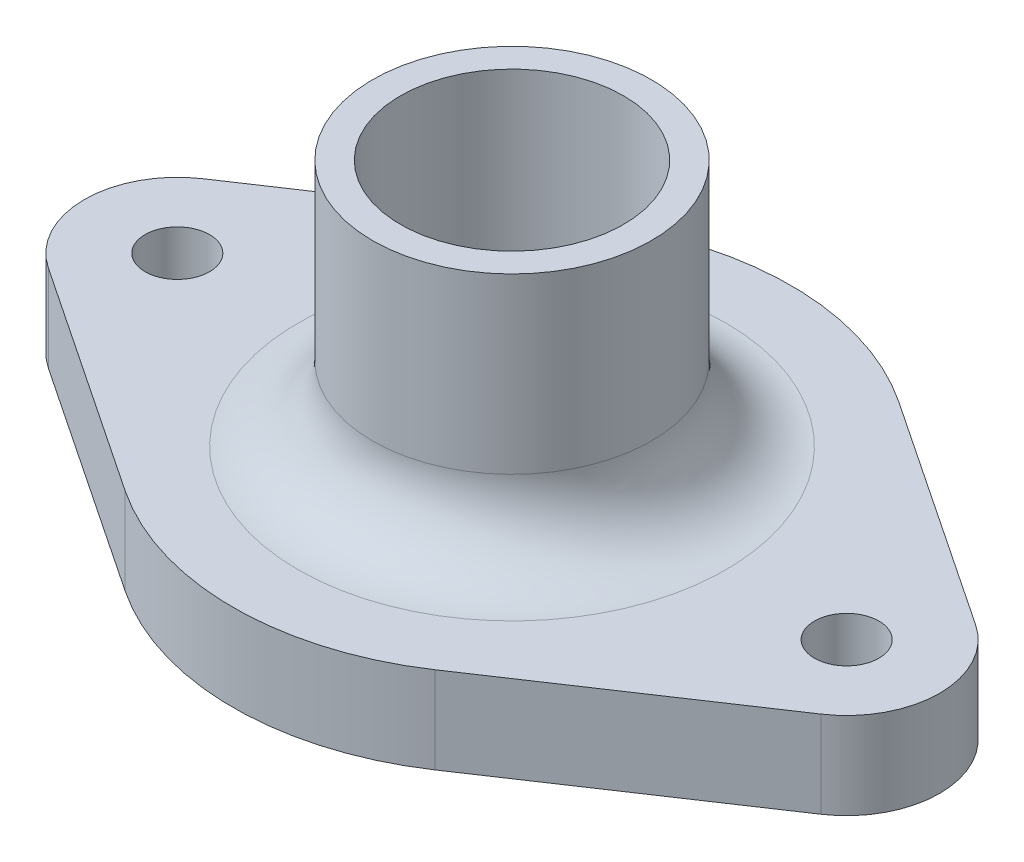
ISO-10303-21;
HEADER;
FILE_DESCRIPTION(('STEP AP214'),'2;1');
FILE_NAME('part.step','',(''),(''),'','','');
FILE_SCHEMA(('AUTOMOTIVE_DESIGN { 1 0 10303 214 1 1 1 1 }'));
ENDSEC;
DATA;
#1=APPLICATION_CONTEXT('core data for automotive mechanical design processes');
#2=APPLICATION_PROTOCOL_DEFINITION('international standard','automotive_design',2000,#1);
#3=PRODUCT_CONTEXT('',#1,'mechanical');
#4=PRODUCT('Part','Part','',(#3));
#5=PRODUCT_RELATED_PRODUCT_CATEGORY('part','',(#4));
#6=PRODUCT_DEFINITION_FORMATION('','',#4);
#7=PRODUCT_DEFINITION_CONTEXT('part definition',#1,'design');
#8=PRODUCT_DEFINITION('design','',#6,#7);
#9=PRODUCT_DEFINITION_SHAPE('','',#8);
#10=(LENGTH_UNIT() NAMED_UNIT(*) SI_UNIT(.MILLI.,.METRE.));
#11=(NAMED_UNIT(*) PLANE_ANGLE_UNIT() SI_UNIT($,.RADIAN.));
#12=(NAMED_UNIT(*) SI_UNIT($,.STERADIAN.) SOLID_ANGLE_UNIT());
#13=UNCERTAINTY_MEASURE_WITH_UNIT(LENGTH_MEASURE(1.E-05),#10,'distance_accuracy_value','');
#14=(GEOMETRIC_REPRESENTATION_CONTEXT(3) GLOBAL_UNCERTAINTY_ASSIGNED_CONTEXT((#13)) GLOBAL_UNIT_ASSIGNED_CONTEXT((#10,
#11,#12)) REPRESENTATION_CONTEXT('',''));
#15=CARTESIAN_POINT('',(0.,0.,0.));
#16=DIRECTION('',(0.,0.,1.));
#17=DIRECTION('',(1.,0.,0.));
#18=AXIS2_PLACEMENT_3D('',#15,#16,#17);
#19=CARTESIAN_POINT('',(0.,7.,0.));
#20=DIRECTION('',(0.,1.,0.));
#21=DIRECTION('',(0.,0.,1.));
#22=AXIS2_PLACEMENT_3D('',#19,#20,#21);
#23=PLANE('',#22);
#24=CARTESIAN_POINT('',(0.,7.,0.));
#25=DIRECTION('',(0.,1.,0.));
#26=DIRECTION('',(0.,0.,1.));
#27=AXIS2_PLACEMENT_3D('',#24,#25,#26);
#28=CIRCLE('',#27,17.25);
#29=CARTESIAN_POINT('',(0.,7.,17.25));
#30=VERTEX_POINT('',#29);
#31=EDGE_CURVE('E11',#30,#30,#28,.F.);
#32=ORIENTED_EDGE('',*,*,#31,.T.);
#33=EDGE_LOOP('',(#32));
#34=FACE_BOUND('',#33,.T.);
#35=CARTESIAN_POINT('',(-27.,7.,0.));
#36=DIRECTION('',(0.,1.,0.));
#37=DIRECTION('',(0.,0.,1.));
#38=AXIS2_PLACEMENT_3D('',#35,#36,#37);
#39=CIRCLE('',#38,2.6);
#40=CARTESIAN_POINT('',(-27.,7.,2.60000000000001));
#41=VERTEX_POINT('',#40);
#42=EDGE_CURVE('E139',#41,#41,#39,.T.);
#43=ORIENTED_EDGE('',*,*,#42,.F.);
#44=EDGE_LOOP('',(#43));
#45=FACE_BOUND('',#44,.T.);
#46=CARTESIAN_POINT('',(0.,7.,0.));
#47=DIRECTION('',(0.,1.,0.));
#48=DIRECTION('',(0.,0.,1.));
#49=AXIS2_PLACEMENT_3D('',#46,#47,#48);
#50=CIRCLE('',#49,22.5);
#51=CARTESIAN_POINT('',(-12.5,7.,18.7082869338697));
#52=VERTEX_POINT('',#51);
#53=CARTESIAN_POINT('',(12.5,7.,18.7082869338697));
#54=VERTEX_POINT('',#53);
#55=EDGE_CURVE('E150',#52,#54,#50,.T.);
#56=ORIENTED_EDGE('',*,*,#55,.T.);
#57=DIRECTION('',(0.831479419283098,0.,-0.555555555555556));
#58=VECTOR('',#57,1.);
#59=CARTESIAN_POINT('',(12.5,7.,18.7082869338697));
#60=LINE('',#59,#58);
#61=CARTESIAN_POINT('',(31.1666666666667,7.,6.23609564462323));
#62=VERTEX_POINT('',#61);
#63=EDGE_CURVE('E98',#54,#62,#60,.T.);
#64=ORIENTED_EDGE('',*,*,#63,.T.);
#65=CARTESIAN_POINT('',(27.,7.,0.));
#66=DIRECTION('',(0.,1.,0.));
#67=DIRECTION('',(0.,0.,1.));
#68=AXIS2_PLACEMENT_3D('',#65,#66,#67);
#69=CIRCLE('',#68,7.5);
#70=CARTESIAN_POINT('',(31.1666666666667,7.,-6.23609564462324));
#71=VERTEX_POINT('',#70);
#72=EDGE_CURVE('E234',#62,#71,#69,.T.);
#73=ORIENTED_EDGE('',*,*,#72,.T.);
#74=DIRECTION('',(-0.831479419283098,0.,-0.555555555555555));
#75=VECTOR('',#74,1.);
#76=CARTESIAN_POINT('',(12.5,7.,-18.7082869338697));
#77=LINE('',#76,#75);
#78=CARTESIAN_POINT('',(12.5,7.,-18.7082869338697));
#79=VERTEX_POINT('',#78);
#80=EDGE_CURVE('E236',#71,#79,#77,.T.);
#81=ORIENTED_EDGE('',*,*,#80,.T.);
#82=CARTESIAN_POINT('',(0.,7.,0.));
#83=DIRECTION('',(0.,1.,0.));
#84=DIRECTION('',(0.,0.,1.));
#85=AXIS2_PLACEMENT_3D('',#82,#83,#84);
#86=CIRCLE('',#85,22.5);
#87=CARTESIAN_POINT('',(-12.5,7.,-18.7082869338697));
#88=VERTEX_POINT('',#87);
#89=EDGE_CURVE('E117',#79,#88,#86,.T.);
#90=ORIENTED_EDGE('',*,*,#89,.T.);
#91=DIRECTION('',(-0.831479419283098,0.,0.555555555555556));
#92=VECTOR('',#91,1.);
#93=CARTESIAN_POINT('',(-31.1666666666667,7.,-6.23609564462322));
#94=LINE('',#93,#92);
#95=CARTESIAN_POINT('',(-31.1666666666667,7.,-6.23609564462322));
#96=VERTEX_POINT('',#95);
#97=EDGE_CURVE('E111',#88,#96,#94,.T.);
#98=ORIENTED_EDGE('',*,*,#97,.T.);
#99=CARTESIAN_POINT('',(-27.,7.,0.));
#100=DIRECTION('',(0.,1.,0.));
#101=DIRECTION('',(0.,0.,1.));
#102=AXIS2_PLACEMENT_3D('',#99,#100,#101);
#103=CIRCLE('',#102,7.5);
#104=CARTESIAN_POINT('',(-31.1666666666667,7.,6.23609564462324));
#105=VERTEX_POINT('',#104);
#106=EDGE_CURVE('E115',#96,#105,#103,.T.);
#107=ORIENTED_EDGE('',*,*,#106,.T.);
#108=DIRECTION('',(0.831479419283098,0.,0.555555555555555));
#109=VECTOR('',#108,1.);
#110=CARTESIAN_POINT('',(-31.1666666666667,7.,6.23609564462324));
#111=LINE('',#110,#109);
#112=EDGE_CURVE('E54',#105,#52,#111,.T.);
#113=ORIENTED_EDGE('',*,*,#112,.T.);
#114=EDGE_LOOP('',(#56,#64,#73,#81,#90,#98,#107,#113));
#115=FACE_BOUND('',#114,.T.);
#116=CARTESIAN_POINT('',(27.,7.,0.));
#117=DIRECTION('',(0.,1.,0.));
#118=DIRECTION('',(0.,0.,1.));
#119=AXIS2_PLACEMENT_3D('',#116,#117,#118);
#120=CIRCLE('',#119,2.6);
#121=CARTESIAN_POINT('',(27.,7.,2.59999999999999));
#122=VERTEX_POINT('',#121);
#123=EDGE_CURVE('E245',#122,#122,#120,.T.);
#124=ORIENTED_EDGE('',*,*,#123,.F.);
#125=EDGE_LOOP('',(#124));
#126=FACE_BOUND('',#125,.T.);
#127=ADVANCED_FACE('F37',(#34,#45,#115,#126),#23,.T.);
#128=CARTESIAN_POINT('',(0.,0.,0.));
#129=DIRECTION('',(0.,1.,0.));
#130=DIRECTION('',(0.,0.,1.));
#131=AXIS2_PLACEMENT_3D('',#128,#129,#130);
#132=PLANE('',#131);
#133=CARTESIAN_POINT('',(0.,0.,0.));
#134=DIRECTION('',(0.,1.,0.));
#135=DIRECTION('',(0.,0.,1.));
#136=AXIS2_PLACEMENT_3D('',#133,#134,#135);
#137=CIRCLE('',#136,22.5);
#138=CARTESIAN_POINT('',(-12.5,0.,18.7082869338697));
#139=VERTEX_POINT('',#138);
#140=CARTESIAN_POINT('',(12.5,0.,18.7082869338697));
#141=VERTEX_POINT('',#140);
#142=EDGE_CURVE('E135',#139,#141,#137,.T.);
#143=ORIENTED_EDGE('',*,*,#142,.F.);
#144=DIRECTION('',(0.831479419283098,0.,0.555555555555555));
#145=VECTOR('',#144,1.);
#146=CARTESIAN_POINT('',(-31.1666666666667,0.,6.23609564462324));
#147=LINE('',#146,#145);
#148=CARTESIAN_POINT('',(-31.1666666666667,0.,6.23609564462324));
#149=VERTEX_POINT('',#148);
#150=EDGE_CURVE('E89',#149,#139,#147,.T.);
#151=ORIENTED_EDGE('',*,*,#150,.F.);
#152=CARTESIAN_POINT('',(-27.,0.,0.));
#153=DIRECTION('',(0.,1.,0.));
#154=DIRECTION('',(0.,0.,1.));
#155=AXIS2_PLACEMENT_3D('',#152,#153,#154);
#156=CIRCLE('',#155,7.5);
#157=CARTESIAN_POINT('',(-31.1666666666667,0.,-6.23609564462322));
#158=VERTEX_POINT('',#157);
#159=EDGE_CURVE('E83',#158,#149,#156,.T.);
#160=ORIENTED_EDGE('',*,*,#159,.F.);
#161=DIRECTION('',(-0.831479419283098,0.,0.555555555555556));
#162=VECTOR('',#161,1.);
#163=CARTESIAN_POINT('',(-31.1666666666667,0.,-6.23609564462322));
#164=LINE('',#163,#162);
#165=CARTESIAN_POINT('',(-12.5,0.,-18.7082869338697));
#166=VERTEX_POINT('',#165);
#167=EDGE_CURVE('E125',#166,#158,#164,.T.);
#168=ORIENTED_EDGE('',*,*,#167,.F.);
#169=CARTESIAN_POINT('',(0.,0.,0.));
#170=DIRECTION('',(0.,1.,0.));
#171=DIRECTION('',(0.,0.,1.));
#172=AXIS2_PLACEMENT_3D('',#169,#170,#171);
#173=CIRCLE('',#172,22.5);
#174=CARTESIAN_POINT('',(12.5,0.,-18.7082869338697));
#175=VERTEX_POINT('',#174);
#176=EDGE_CURVE('E145',#175,#166,#173,.T.);
#177=ORIENTED_EDGE('',*,*,#176,.F.);
#178=DIRECTION('',(-0.831479419283098,0.,-0.555555555555555));
#179=VECTOR('',#178,1.);
#180=CARTESIAN_POINT('',(12.5,0.,-18.7082869338697));
#181=LINE('',#180,#179);
#182=CARTESIAN_POINT('',(31.1666666666667,0.,-6.23609564462324));
#183=VERTEX_POINT('',#182);
#184=EDGE_CURVE('E143',#183,#175,#181,.T.);
#185=ORIENTED_EDGE('',*,*,#184,.F.);
#186=CARTESIAN_POINT('',(27.,0.,0.));
#187=DIRECTION('',(0.,1.,0.));
#188=DIRECTION('',(0.,0.,1.));
#189=AXIS2_PLACEMENT_3D('',#186,#187,#188);
#190=CIRCLE('',#189,7.5);
#191=CARTESIAN_POINT('',(31.1666666666667,0.,6.23609564462323));
#192=VERTEX_POINT('',#191);
#193=EDGE_CURVE('E141',#192,#183,#190,.T.);
#194=ORIENTED_EDGE('',*,*,#193,.F.);
#195=DIRECTION('',(0.831479419283098,0.,-0.555555555555556));
#196=VECTOR('',#195,1.);
#197=CARTESIAN_POINT('',(12.5,0.,18.7082869338697));
#198=LINE('',#197,#196);
#199=EDGE_CURVE('E138',#141,#192,#198,.T.);
#200=ORIENTED_EDGE('',*,*,#199,.F.);
#201=EDGE_LOOP('',(#143,#151,#160,#168,#177,#185,#194,#200));
#202=FACE_BOUND('',#201,.T.);
#203=CARTESIAN_POINT('',(-27.,0.,0.));
#204=DIRECTION('',(0.,1.,0.));
#205=DIRECTION('',(0.,0.,1.));
#206=AXIS2_PLACEMENT_3D('',#203,#204,#205);
#207=CIRCLE('',#206,2.6);
#208=CARTESIAN_POINT('',(-27.,0.,2.60000000000001));
#209=VERTEX_POINT('',#208);
#210=EDGE_CURVE('E242',#209,#209,#207,.T.);
#211=ORIENTED_EDGE('',*,*,#210,.T.);
#212=EDGE_LOOP('',(#211));
#213=FACE_BOUND('',#212,.T.);
#214=CARTESIAN_POINT('',(27.,0.,0.));
#215=DIRECTION('',(0.,1.,0.));
#216=DIRECTION('',(0.,0.,1.));
#217=AXIS2_PLACEMENT_3D('',#214,#215,#216);
#218=CIRCLE('',#217,2.6);
#219=CARTESIAN_POINT('',(27.,0.,2.59999999999999));
#220=VERTEX_POINT('',#219);
#221=EDGE_CURVE('E248',#220,#220,#218,.T.);
#222=ORIENTED_EDGE('',*,*,#221,.T.);
#223=EDGE_LOOP('',(#222));
#224=FACE_BOUND('',#223,.T.);
#225=ADVANCED_FACE('F187',(#202,#213,#224),#132,.F.);
#226=CARTESIAN_POINT('',(0.,7.,0.));
#227=DIRECTION('',(0.,-1.,0.));
#228=DIRECTION('',(0.,0.,-1.));
#229=AXIS2_PLACEMENT_3D('',#226,#227,#228);
#230=CYLINDRICAL_SURFACE('',#229,22.5);
#231=ORIENTED_EDGE('',*,*,#142,.T.);
#232=DIRECTION('',(0.,-1.,0.));
#233=VECTOR('',#232,1.);
#234=CARTESIAN_POINT('',(12.5,7.,18.7082869338697));
#235=LINE('',#234,#233);
#236=EDGE_CURVE('E163',#54,#141,#235,.T.);
#237=ORIENTED_EDGE('',*,*,#236,.F.);
#238=ORIENTED_EDGE('',*,*,#55,.F.);
#239=DIRECTION('',(0.,-1.,0.));
#240=VECTOR('',#239,1.);
#241=CARTESIAN_POINT('',(-12.5,7.,18.7082869338697));
#242=LINE('',#241,#240);
#243=EDGE_CURVE('E131',#52,#139,#242,.T.);
#244=ORIENTED_EDGE('',*,*,#243,.T.);
#245=EDGE_LOOP('',(#231,#237,#238,#244));
#246=FACE_BOUND('',#245,.T.);
#247=ADVANCED_FACE('F193',(#246),#230,.T.);
#248=CARTESIAN_POINT('',(12.5,7.,18.7082869338697));
#249=DIRECTION('',(-0.555555555555556,0.,-0.831479419283098));
#250=DIRECTION('',(-0.831479419283098,0.,0.555555555555556));
#251=AXIS2_PLACEMENT_3D('',#248,#249,#250);
#252=PLANE('',#251);
#253=ORIENTED_EDGE('',*,*,#199,.T.);
#254=DIRECTION('',(0.,-1.,0.));
#255=VECTOR('',#254,1.);
#256=CARTESIAN_POINT('',(31.1666666666667,7.,6.23609564462323));
#257=LINE('',#256,#255);
#258=EDGE_CURVE('E160',#62,#192,#257,.T.);
#259=ORIENTED_EDGE('',*,*,#258,.F.);
#260=ORIENTED_EDGE('',*,*,#63,.F.);
#261=ORIENTED_EDGE('',*,*,#236,.T.);
#262=EDGE_LOOP('',(#253,#259,#260,#261));
#263=FACE_BOUND('',#262,.T.);
#264=ADVANCED_FACE('F219',(#263),#252,.F.);
#265=CARTESIAN_POINT('',(27.,7.,0.));
#266=DIRECTION('',(0.,-1.,0.));
#267=DIRECTION('',(0.,0.,-1.));
#268=AXIS2_PLACEMENT_3D('',#265,#266,#267);
#269=CYLINDRICAL_SURFACE('',#268,7.5);
#270=ORIENTED_EDGE('',*,*,#193,.T.);
#271=DIRECTION('',(0.,-1.,0.));
#272=VECTOR('',#271,1.);
#273=CARTESIAN_POINT('',(31.1666666666667,7.,-6.23609564462324));
#274=LINE('',#273,#272);
#275=EDGE_CURVE('E157',#71,#183,#274,.T.);
#276=ORIENTED_EDGE('',*,*,#275,.F.);
#277=ORIENTED_EDGE('',*,*,#72,.F.);
#278=ORIENTED_EDGE('',*,*,#258,.T.);
#279=EDGE_LOOP('',(#270,#276,#277,#278));
#280=FACE_BOUND('',#279,.T.);
#281=ADVANCED_FACE('F215',(#280),#269,.T.);
#282=CARTESIAN_POINT('',(12.5,7.,-18.7082869338697));
#283=DIRECTION('',(-0.555555555555555,0.,0.831479419283098));
#284=DIRECTION('',(0.831479419283098,0.,0.555555555555555));
#285=AXIS2_PLACEMENT_3D('',#282,#283,#284);
#286=PLANE('',#285);
#287=ORIENTED_EDGE('',*,*,#184,.T.);
#288=DIRECTION('',(0.,-1.,0.));
#289=VECTOR('',#288,1.);
#290=CARTESIAN_POINT('',(12.5,7.,-18.7082869338697));
#291=LINE('',#290,#289);
#292=EDGE_CURVE('E154',#79,#175,#291,.T.);
#293=ORIENTED_EDGE('',*,*,#292,.F.);
#294=ORIENTED_EDGE('',*,*,#80,.F.);
#295=ORIENTED_EDGE('',*,*,#275,.T.);
#296=EDGE_LOOP('',(#287,#293,#294,#295));
#297=FACE_BOUND('',#296,.T.);
#298=ADVANCED_FACE('F211',(#297),#286,.F.);
#299=CARTESIAN_POINT('',(0.,7.,0.));
#300=DIRECTION('',(0.,-1.,0.));
#301=DIRECTION('',(0.,0.,-1.));
#302=AXIS2_PLACEMENT_3D('',#299,#300,#301);
#303=CYLINDRICAL_SURFACE('',#302,22.5);
#304=ORIENTED_EDGE('',*,*,#176,.T.);
#305=DIRECTION('',(0.,-1.,0.));
#306=VECTOR('',#305,1.);
#307=CARTESIAN_POINT('',(-12.5,7.,-18.7082869338697));
#308=LINE('',#307,#306);
#309=EDGE_CURVE('E126',#88,#166,#308,.T.);
#310=ORIENTED_EDGE('',*,*,#309,.F.);
#311=ORIENTED_EDGE('',*,*,#89,.F.);
#312=ORIENTED_EDGE('',*,*,#292,.T.);
#313=EDGE_LOOP('',(#304,#310,#311,#312));
#314=FACE_BOUND('',#313,.T.);
#315=ADVANCED_FACE('F208',(#314),#303,.T.);
#316=CARTESIAN_POINT('',(-31.1666666666667,7.,-6.23609564462322));
#317=DIRECTION('',(0.555555555555556,0.,0.831479419283098));
#318=DIRECTION('',(0.831479419283098,0.,-0.555555555555556));
#319=AXIS2_PLACEMENT_3D('',#316,#317,#318);
#320=PLANE('',#319);
#321=ORIENTED_EDGE('',*,*,#167,.T.);
#322=DIRECTION('',(0.,-1.,0.));
#323=VECTOR('',#322,1.);
#324=CARTESIAN_POINT('',(-31.1666666666667,7.,-6.23609564462322));
#325=LINE('',#324,#323);
#326=EDGE_CURVE('E122',#96,#158,#325,.T.);
#327=ORIENTED_EDGE('',*,*,#326,.F.);
#328=ORIENTED_EDGE('',*,*,#97,.F.);
#329=ORIENTED_EDGE('',*,*,#309,.T.);
#330=EDGE_LOOP('',(#321,#327,#328,#329));
#331=FACE_BOUND('',#330,.T.);
#332=ADVANCED_FACE('F123',(#331),#320,.F.);
#333=CARTESIAN_POINT('',(-27.,7.,0.));
#334=DIRECTION('',(0.,-1.,0.));
#335=DIRECTION('',(0.,0.,-1.));
#336=AXIS2_PLACEMENT_3D('',#333,#334,#335);
#337=CYLINDRICAL_SURFACE('',#336,7.5);
#338=ORIENTED_EDGE('',*,*,#159,.T.);
#339=DIRECTION('',(0.,-1.,0.));
#340=VECTOR('',#339,1.);
#341=CARTESIAN_POINT('',(-31.1666666666667,7.,6.23609564462324));
#342=LINE('',#341,#340);
#343=EDGE_CURVE('E127',#105,#149,#342,.T.);
#344=ORIENTED_EDGE('',*,*,#343,.F.);
#345=ORIENTED_EDGE('',*,*,#106,.F.);
#346=ORIENTED_EDGE('',*,*,#326,.T.);
#347=EDGE_LOOP('',(#338,#344,#345,#346));
#348=FACE_BOUND('',#347,.T.);
#349=ADVANCED_FACE('F129',(#348),#337,.T.);
#350=CARTESIAN_POINT('',(-31.1666666666667,7.,6.23609564462324));
#351=DIRECTION('',(0.555555555555555,0.,-0.831479419283098));
#352=DIRECTION('',(-0.831479419283098,0.,-0.555555555555555));
#353=AXIS2_PLACEMENT_3D('',#350,#351,#352);
#354=PLANE('',#353);
#355=ORIENTED_EDGE('',*,*,#150,.T.);
#356=ORIENTED_EDGE('',*,*,#243,.F.);
#357=ORIENTED_EDGE('',*,*,#112,.F.);
#358=ORIENTED_EDGE('',*,*,#343,.T.);
#359=EDGE_LOOP('',(#355,#356,#357,#358));
#360=FACE_BOUND('',#359,.T.);
#361=ADVANCED_FACE('F201',(#360),#354,.F.);
#362=CARTESIAN_POINT('',(-27.,7.,0.));
#363=DIRECTION('',(0.,-1.,0.));
#364=DIRECTION('',(0.,0.,-1.));
#365=AXIS2_PLACEMENT_3D('',#362,#363,#364);
#366=CYLINDRICAL_SURFACE('',#365,2.6);
#367=ORIENTED_EDGE('',*,*,#42,.T.);
#368=EDGE_LOOP('',(#367));
#369=FACE_BOUND('',#368,.T.);
#370=ORIENTED_EDGE('',*,*,#210,.F.);
#371=EDGE_LOOP('',(#370));
#372=FACE_BOUND('',#371,.T.);
#373=ADVANCED_FACE('F198',(#369,#372),#366,.F.);
#374=CARTESIAN_POINT('',(27.,7.,0.));
#375=DIRECTION('',(0.,-1.,0.));
#376=DIRECTION('',(0.,0.,-1.));
#377=AXIS2_PLACEMENT_3D('',#374,#375,#376);
#378=CYLINDRICAL_SURFACE('',#377,2.6);
#379=ORIENTED_EDGE('',*,*,#123,.T.);
#380=EDGE_LOOP('',(#379));
#381=FACE_BOUND('',#380,.T.);
#382=ORIENTED_EDGE('',*,*,#221,.F.);
#383=EDGE_LOOP('',(#382));
#384=FACE_BOUND('',#383,.T.);
#385=ADVANCED_FACE('F268',(#381,#384),#378,.F.);
#386=CARTESIAN_POINT('',(0.,27.,0.));
#387=DIRECTION('',(0.,1.,0.));
#388=DIRECTION('',(0.,0.,1.));
#389=AXIS2_PLACEMENT_3D('',#386,#387,#388);
#390=PLANE('',#389);
#391=CARTESIAN_POINT('',(0.,27.,0.));
#392=DIRECTION('',(0.,1.,0.));
#393=DIRECTION('',(0.,0.,1.));
#394=AXIS2_PLACEMENT_3D('',#391,#392,#393);
#395=CIRCLE('',#394,9.);
#396=CARTESIAN_POINT('',(0.,27.,-9.));
#397=VERTEX_POINT('',#396);
#398=EDGE_CURVE('E165',#397,#397,#395,.F.);
#399=ORIENTED_EDGE('',*,*,#398,.T.);
#400=EDGE_LOOP('',(#399));
#401=FACE_BOUND('',#400,.T.);
#402=CARTESIAN_POINT('',(0.,27.,0.));
#403=DIRECTION('',(0.,1.,0.));
#404=DIRECTION('',(0.,0.,1.));
#405=AXIS2_PLACEMENT_3D('',#402,#403,#404);
#406=CIRCLE('',#405,11.25);
#407=CARTESIAN_POINT('',(0.,27.,11.25));
#408=VERTEX_POINT('',#407);
#409=EDGE_CURVE('E167',#408,#408,#406,.T.);
#410=ORIENTED_EDGE('',*,*,#409,.T.);
#411=EDGE_LOOP('',(#410));
#412=FACE_BOUND('',#411,.T.);
#413=ADVANCED_FACE('F264',(#401,#412),#390,.T.);
#414=CARTESIAN_POINT('',(0.,27.,0.));
#415=DIRECTION('',(0.,-1.,0.));
#416=DIRECTION('',(0.,0.,-1.));
#417=AXIS2_PLACEMENT_3D('',#414,#415,#416);
#418=CYLINDRICAL_SURFACE('',#417,11.25);
#419=CARTESIAN_POINT('',(0.,13.,0.));
#420=DIRECTION('',(0.,1.,0.));
#421=DIRECTION('',(0.,0.,1.));
#422=AXIS2_PLACEMENT_3D('',#419,#420,#421);
#423=CIRCLE('',#422,11.25);
#424=CARTESIAN_POINT('',(0.,13.,11.25));
#425=VERTEX_POINT('',#424);
#426=EDGE_CURVE('E46',#425,#425,#423,.T.);
#427=ORIENTED_EDGE('',*,*,#426,.T.);
#428=EDGE_LOOP('',(#427));
#429=FACE_BOUND('',#428,.T.);
#430=ORIENTED_EDGE('',*,*,#409,.F.);
#431=EDGE_LOOP('',(#430));
#432=FACE_BOUND('',#431,.T.);
#433=ADVANCED_FACE('F172',(#429,#432),#418,.T.);
#434=CARTESIAN_POINT('',(0.,47.,0.));
#435=DIRECTION('',(0.,-1.,0.));
#436=DIRECTION('',(0.,0.,-1.));
#437=AXIS2_PLACEMENT_3D('',#434,#435,#436);
#438=CYLINDRICAL_SURFACE('',#437,9.);
#439=CARTESIAN_POINT('',(0.,2.,0.));
#440=DIRECTION('',(0.,1.,0.));
#441=DIRECTION('',(0.,0.,1.));
#442=AXIS2_PLACEMENT_3D('',#439,#440,#441);
#443=CIRCLE('',#442,9.);
#444=CARTESIAN_POINT('',(0.,2.00000000000001,-9.));
#445=VERTEX_POINT('',#444);
#446=EDGE_CURVE('E168',#445,#445,#443,.T.);
#447=CARTESIAN_POINT('',(0.,27.,-9.));
#448=CARTESIAN_POINT('',(0.,26.7395833333333,-9.));
#449=CARTESIAN_POINT('',(0.,26.4791666666667,-9.));
#450=CARTESIAN_POINT('',(0.,25.9583333333333,-9.));
#451=CARTESIAN_POINT('',(0.,25.6979166666667,-9.));
#452=CARTESIAN_POINT('',(0.,25.1770833333333,-9.));
#453=CARTESIAN_POINT('',(0.,24.9166666666667,-9.));
#454=CARTESIAN_POINT('',(0.,24.3958333333333,-9.));
#455=CARTESIAN_POINT('',(0.,24.1354166666667,-9.));
#456=CARTESIAN_POINT('',(0.,23.6145833333333,-9.));
#457=CARTESIAN_POINT('',(0.,23.3541666666667,-9.));
#458=CARTESIAN_POINT('',(0.,22.8333333333333,-9.));
#459=CARTESIAN_POINT('',(0.,22.5729166666667,-9.));
#460=CARTESIAN_POINT('',(0.,22.0520833333333,-9.));
#461=CARTESIAN_POINT('',(0.,21.7916666666667,-9.));
#462=CARTESIAN_POINT('',(0.,21.2708333333333,-9.));
#463=CARTESIAN_POINT('',(0.,21.0104166666667,-9.));
#464=CARTESIAN_POINT('',(0.,20.4895833333333,-9.));
#465=CARTESIAN_POINT('',(0.,20.2291666666667,-9.));
#466=CARTESIAN_POINT('',(0.,19.7083333333333,-9.));
#467=CARTESIAN_POINT('',(0.,19.4479166666667,-9.));
#468=CARTESIAN_POINT('',(0.,18.9270833333333,-9.));
#469=CARTESIAN_POINT('',(0.,18.6666666666667,-9.));
#470=CARTESIAN_POINT('',(0.,18.1458333333333,-9.));
#471=CARTESIAN_POINT('',(0.,17.8854166666667,-9.));
#472=CARTESIAN_POINT('',(0.,17.3645833333333,-9.));
#473=CARTESIAN_POINT('',(0.,17.1041666666667,-9.));
#474=CARTESIAN_POINT('',(0.,16.5833333333333,-9.));
#475=CARTESIAN_POINT('',(0.,16.3229166666667,-9.));
#476=CARTESIAN_POINT('',(0.,15.8020833333333,-9.));
#477=CARTESIAN_POINT('',(0.,15.5416666666667,-9.));
#478=CARTESIAN_POINT('',(0.,15.0208333333333,-9.));
#479=CARTESIAN_POINT('',(0.,14.7604166666667,-9.));
#480=CARTESIAN_POINT('',(0.,14.2395833333333,-9.));
#481=CARTESIAN_POINT('',(0.,13.9791666666667,-9.));
#482=CARTESIAN_POINT('',(0.,13.4583333333333,-9.));
#483=CARTESIAN_POINT('',(0.,13.1979166666667,-9.));
#484=CARTESIAN_POINT('',(0.,12.6770833333333,-9.));
#485=CARTESIAN_POINT('',(0.,12.4166666666667,-9.));
#486=CARTESIAN_POINT('',(0.,11.8958333333333,-9.));
#487=CARTESIAN_POINT('',(0.,11.6354166666667,-9.));
#488=CARTESIAN_POINT('',(0.,11.1145833333333,-9.));
#489=CARTESIAN_POINT('',(0.,10.8541666666667,-9.));
#490=CARTESIAN_POINT('',(0.,10.3333333333333,-9.));
#491=CARTESIAN_POINT('',(0.,10.0729166666667,-9.));
#492=CARTESIAN_POINT('',(0.,9.55208333333334,-9.));
#493=CARTESIAN_POINT('',(0.,9.29166666666668,-9.));
#494=CARTESIAN_POINT('',(0.,8.77083333333334,-9.));
#495=CARTESIAN_POINT('',(0.,8.51041666666667,-9.));
#496=CARTESIAN_POINT('',(0.,7.98958333333334,-9.));
#497=CARTESIAN_POINT('',(0.,7.72916666666667,-9.));
#498=CARTESIAN_POINT('',(0.,7.20833333333334,-9.));
#499=CARTESIAN_POINT('',(0.,6.94791666666667,-9.));
#500=CARTESIAN_POINT('',(0.,6.42708333333334,-9.));
#501=CARTESIAN_POINT('',(0.,6.16666666666667,-9.));
#502=CARTESIAN_POINT('',(0.,5.64583333333334,-9.));
#503=CARTESIAN_POINT('',(0.,5.38541666666668,-9.));
#504=CARTESIAN_POINT('',(0.,4.86458333333334,-9.));
#505=CARTESIAN_POINT('',(0.,4.60416666666668,-9.));
#506=CARTESIAN_POINT('',(0.,4.08333333333334,-9.));
#507=CARTESIAN_POINT('',(0.,3.82291666666668,-9.));
#508=CARTESIAN_POINT('',(0.,3.30208333333334,-9.));
#509=CARTESIAN_POINT('',(0.,3.04166666666667,-9.));
#510=CARTESIAN_POINT('',(0.,2.52083333333334,-9.));
#511=CARTESIAN_POINT('',(0.,2.26041666666667,-9.));
#512=CARTESIAN_POINT('',(0.,2.00000000000001,-9.));
#513=B_SPLINE_CURVE_WITH_KNOTS('',3,(#447,#448,#449,#450,#451,#452,#453,#454,#455,#456,#457,
#458,#459,#460,#461,#462,#463,#464,#465,#466,#467,#468,#469,#470,#471,#472,#473,#474,#475,#476,
#477,#478,#479,#480,#481,#482,#483,#484,#485,#486,#487,#488,#489,#490,#491,#492,#493,#494,#495,
#496,#497,#498,#499,#500,#501,#502,#503,#504,#505,#506,#507,#508,#509,#510,#511,#512),
.UNSPECIFIED.,.F.,.F.,(4,2,2,2,2,2,2,2,2,2,2,2,2,2,2,2,2,2,2,2,2,2,2,2,2,2,2,2,2,2,2,2,4),(0.,
0.781250000000001,1.5625,2.34375,3.125,3.90625,4.6875,5.46875,6.25,7.03125,7.8125,8.59375,9.375,
10.15625,10.9375,11.71875,12.5,13.28125,14.0625,14.84375,15.625,16.40625,17.1875,17.96875,18.75,
19.53125,20.3125,21.09375,21.875,22.65625,23.4375,24.21875,25.),.UNSPECIFIED.);
#514=EDGE_CURVE('BSEAM182',#397,#445,#513,.T.);
#515=ORIENTED_EDGE('',*,*,#398,.F.);
#516=ORIENTED_EDGE('',*,*,#446,.F.);
#517=ORIENTED_EDGE('',*,*,#514,.T.);
#518=ORIENTED_EDGE('',*,*,#514,.F.);
#519=EDGE_LOOP('',(#515,#517,#516,#518));
#520=FACE_BOUND('',#519,.T.);
#521=ADVANCED_FACE('F182',(#520),#438,.F.);
#522=CARTESIAN_POINT('',(0.,2.,0.));
#523=DIRECTION('',(0.,1.,0.));
#524=DIRECTION('',(0.,0.,1.));
#525=AXIS2_PLACEMENT_3D('',#522,#523,#524);
#526=PLANE('',#525);
#527=ORIENTED_EDGE('',*,*,#446,.T.);
#528=EDGE_LOOP('',(#527));
#529=FACE_BOUND('',#528,.T.);
#530=ADVANCED_FACE('F176',(#529),#526,.T.);
#531=CARTESIAN_POINT('',(0.,13.,0.));
#532=DIRECTION('',(0.,1.,0.));
#533=DIRECTION('',(0.,0.,1.));
#534=AXIS2_PLACEMENT_3D('',#531,#532,#533);
#535=TOROIDAL_SURFACE('',#534,17.25,6.);
#536=ORIENTED_EDGE('',*,*,#31,.F.);
#537=EDGE_LOOP('',(#536));
#538=FACE_BOUND('',#537,.T.);
#539=ORIENTED_EDGE('',*,*,#426,.F.);
#540=EDGE_LOOP('',(#539));
#541=FACE_BOUND('',#540,.T.);
#542=ADVANCED_FACE('F39',(#538,#541),#535,.F.);
#543=CLOSED_SHELL('',(#127,#225,#247,#264,#281,#298,#315,#332,#349,#361,#373,#385,#413,#433,
#521,#530,#542));
#544=MANIFOLD_SOLID_BREP('B2',#543);
#545=ADVANCED_BREP_SHAPE_REPRESENTATION('',(#18,#544),#14);
#546=SHAPE_DEFINITION_REPRESENTATION(#9,#545);
ENDSEC;
END-ISO-10303-21;
